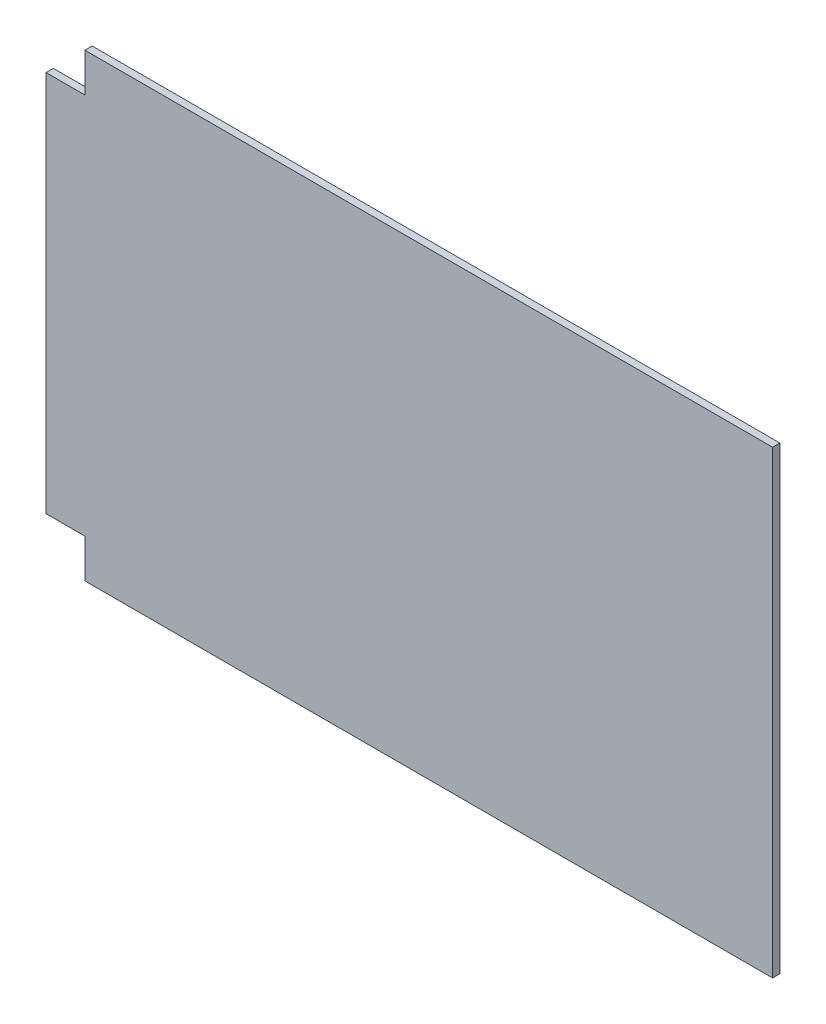
ISO-10303-21;
HEADER;
FILE_DESCRIPTION(('STEP AP214'),'2;1');
FILE_NAME('part.step','',(''),(''),'','','');
FILE_SCHEMA(('AUTOMOTIVE_DESIGN { 1 0 10303 214 1 1 1 1 }'));
ENDSEC;
DATA;
#1=APPLICATION_CONTEXT('core data for automotive mechanical design processes');
#2=APPLICATION_PROTOCOL_DEFINITION('international standard','automotive_design',2000,#1);
#3=PRODUCT_CONTEXT('',#1,'mechanical');
#4=PRODUCT('Part','Part','',(#3));
#5=PRODUCT_RELATED_PRODUCT_CATEGORY('part','',(#4));
#6=PRODUCT_DEFINITION_FORMATION('','',#4);
#7=PRODUCT_DEFINITION_CONTEXT('part definition',#1,'design');
#8=PRODUCT_DEFINITION('design','',#6,#7);
#9=PRODUCT_DEFINITION_SHAPE('','',#8);
#10=(LENGTH_UNIT() NAMED_UNIT(*) SI_UNIT(.MILLI.,.METRE.));
#11=(NAMED_UNIT(*) PLANE_ANGLE_UNIT() SI_UNIT($,.RADIAN.));
#12=(NAMED_UNIT(*) SI_UNIT($,.STERADIAN.) SOLID_ANGLE_UNIT());
#13=UNCERTAINTY_MEASURE_WITH_UNIT(LENGTH_MEASURE(1.E-05),#10,'distance_accuracy_value','');
#14=(GEOMETRIC_REPRESENTATION_CONTEXT(3) GLOBAL_UNCERTAINTY_ASSIGNED_CONTEXT((#13)) GLOBAL_UNIT_ASSIGNED_CONTEXT((#10,
#11,#12)) REPRESENTATION_CONTEXT('',''));
#15=CARTESIAN_POINT('',(0.,0.,0.));
#16=DIRECTION('',(0.,0.,1.));
#17=DIRECTION('',(1.,0.,0.));
#18=AXIS2_PLACEMENT_3D('',#15,#16,#17);
#19=CARTESIAN_POINT('',(-250.4,150.400000000001,4.75));
#20=DIRECTION('',(1.,0.,0.));
#21=DIRECTION('',(0.,1.,0.));
#22=AXIS2_PLACEMENT_3D('',#19,#20,#21);
#23=PLANE('',#22);
#24=DIRECTION('',(0.,-1.,0.));
#25=VECTOR('',#24,1.);
#26=CARTESIAN_POINT('',(-250.4,150.400000000001,4.75));
#27=LINE('',#26,#25);
#28=CARTESIAN_POINT('',(-250.4,125.000000000001,4.75));
#29=VERTEX_POINT('',#28);
#30=CARTESIAN_POINT('',(-250.4,-124.999999999999,4.75));
#31=VERTEX_POINT('',#30);
#32=EDGE_CURVE('E121',#29,#31,#27,.T.);
#33=ORIENTED_EDGE('',*,*,#32,.F.);
#34=DIRECTION('',(0.,0.,-1.));
#35=VECTOR('',#34,1.);
#36=CARTESIAN_POINT('',(-250.4,125.000000000001,10.));
#37=LINE('',#36,#35);
#38=CARTESIAN_POINT('',(-250.4,125.000000000001,0.));
#39=VERTEX_POINT('',#38);
#40=EDGE_CURVE('E110',#29,#39,#37,.T.);
#41=ORIENTED_EDGE('',*,*,#40,.T.);
#42=DIRECTION('',(0.,-1.,0.));
#43=VECTOR('',#42,1.);
#44=CARTESIAN_POINT('',(-250.4,150.400000000001,0.));
#45=LINE('',#44,#43);
#46=CARTESIAN_POINT('',(-250.4,-124.999999999999,0.));
#47=VERTEX_POINT('',#46);
#48=EDGE_CURVE('E125',#39,#47,#45,.T.);
#49=ORIENTED_EDGE('',*,*,#48,.T.);
#50=DIRECTION('',(0.,0.,-1.));
#51=VECTOR('',#50,1.);
#52=CARTESIAN_POINT('',(-250.4,-124.999999999999,10.));
#53=LINE('',#52,#51);
#54=EDGE_CURVE('E142',#31,#47,#53,.T.);
#55=ORIENTED_EDGE('',*,*,#54,.F.);
#56=EDGE_LOOP('',(#33,#41,#49,#55));
#57=FACE_BOUND('',#56,.T.);
#58=ADVANCED_FACE('F37',(#57),#23,.F.);
#59=CARTESIAN_POINT('',(-250.4,-150.399999999999,4.75));
#60=DIRECTION('',(0.,1.,0.));
#61=DIRECTION('',(0.,0.,1.));
#62=AXIS2_PLACEMENT_3D('',#59,#60,#61);
#63=PLANE('',#62);
#64=DIRECTION('',(1.,0.,0.));
#65=VECTOR('',#64,1.);
#66=CARTESIAN_POINT('',(-250.4,-150.399999999999,0.));
#67=LINE('',#66,#65);
#68=CARTESIAN_POINT('',(-225.,-150.399999999999,0.));
#69=VERTEX_POINT('',#68);
#70=CARTESIAN_POINT('',(225.,-150.399999999999,0.));
#71=VERTEX_POINT('',#70);
#72=EDGE_CURVE('E122',#69,#71,#67,.T.);
#73=ORIENTED_EDGE('',*,*,#72,.T.);
#74=DIRECTION('',(0.,0.,-1.));
#75=VECTOR('',#74,1.);
#76=CARTESIAN_POINT('',(225.,-150.399999999999,10.));
#77=LINE('',#76,#75);
#78=CARTESIAN_POINT('',(225.,-150.399999999999,4.75));
#79=VERTEX_POINT('',#78);
#80=EDGE_CURVE('E53',#79,#71,#77,.T.);
#81=ORIENTED_EDGE('',*,*,#80,.F.);
#82=DIRECTION('',(1.,0.,0.));
#83=VECTOR('',#82,1.);
#84=CARTESIAN_POINT('',(-250.4,-150.399999999999,4.75));
#85=LINE('',#84,#83);
#86=CARTESIAN_POINT('',(-225.,-150.399999999999,4.75));
#87=VERTEX_POINT('',#86);
#88=EDGE_CURVE('E45',#87,#79,#85,.T.);
#89=ORIENTED_EDGE('',*,*,#88,.F.);
#90=DIRECTION('',(0.,0.,-1.));
#91=VECTOR('',#90,1.);
#92=CARTESIAN_POINT('',(-225.,-150.399999999999,10.));
#93=LINE('',#92,#91);
#94=EDGE_CURVE('E147',#87,#69,#93,.T.);
#95=ORIENTED_EDGE('',*,*,#94,.T.);
#96=EDGE_LOOP('',(#73,#81,#89,#95));
#97=FACE_BOUND('',#96,.T.);
#98=ADVANCED_FACE('F177',(#97),#63,.F.);
#99=CARTESIAN_POINT('',(-250.4,150.400000000001,4.75));
#100=DIRECTION('',(0.,1.,0.));
#101=DIRECTION('',(0.,0.,1.));
#102=AXIS2_PLACEMENT_3D('',#99,#100,#101);
#103=PLANE('',#102);
#104=DIRECTION('',(0.,0.,-1.));
#105=VECTOR('',#104,1.);
#106=CARTESIAN_POINT('',(225.,150.400000000001,10.));
#107=LINE('',#106,#105);
#108=CARTESIAN_POINT('',(225.,150.400000000001,4.75));
#109=VERTEX_POINT('',#108);
#110=CARTESIAN_POINT('',(225.,150.400000000001,0.));
#111=VERTEX_POINT('',#110);
#112=EDGE_CURVE('E104',#109,#111,#107,.T.);
#113=ORIENTED_EDGE('',*,*,#112,.T.);
#114=DIRECTION('',(1.,0.,0.));
#115=VECTOR('',#114,1.);
#116=CARTESIAN_POINT('',(-250.4,150.400000000001,0.));
#117=LINE('',#116,#115);
#118=CARTESIAN_POINT('',(-225.,150.400000000001,0.));
#119=VERTEX_POINT('',#118);
#120=EDGE_CURVE('E40',#119,#111,#117,.T.);
#121=ORIENTED_EDGE('',*,*,#120,.F.);
#122=DIRECTION('',(0.,0.,-1.));
#123=VECTOR('',#122,1.);
#124=CARTESIAN_POINT('',(-225.,150.400000000001,10.));
#125=LINE('',#124,#123);
#126=CARTESIAN_POINT('',(-225.,150.400000000001,4.75));
#127=VERTEX_POINT('',#126);
#128=EDGE_CURVE('E61',#127,#119,#125,.T.);
#129=ORIENTED_EDGE('',*,*,#128,.F.);
#130=DIRECTION('',(1.,0.,0.));
#131=VECTOR('',#130,1.);
#132=CARTESIAN_POINT('',(-250.4,150.400000000001,4.75));
#133=LINE('',#132,#131);
#134=EDGE_CURVE('E11',#127,#109,#133,.T.);
#135=ORIENTED_EDGE('',*,*,#134,.T.);
#136=EDGE_LOOP('',(#113,#121,#129,#135));
#137=FACE_BOUND('',#136,.T.);
#138=ADVANCED_FACE('F114',(#137),#103,.T.);
#139=CARTESIAN_POINT('',(0.,0.,4.75));
#140=DIRECTION('',(0.,0.,1.));
#141=DIRECTION('',(1.,0.,0.));
#142=AXIS2_PLACEMENT_3D('',#139,#140,#141);
#143=PLANE('',#142);
#144=DIRECTION('',(0.,-1.,0.));
#145=VECTOR('',#144,1.);
#146=CARTESIAN_POINT('',(225.,0.,4.75));
#147=LINE('',#146,#145);
#148=EDGE_CURVE('E129',#109,#79,#147,.T.);
#149=ORIENTED_EDGE('',*,*,#148,.F.);
#150=ORIENTED_EDGE('',*,*,#134,.F.);
#151=DIRECTION('',(0.,1.,0.));
#152=VECTOR('',#151,1.);
#153=CARTESIAN_POINT('',(-225.,0.,4.75));
#154=LINE('',#153,#152);
#155=CARTESIAN_POINT('',(-225.,125.000000000001,4.75));
#156=VERTEX_POINT('',#155);
#157=EDGE_CURVE('E137',#156,#127,#154,.T.);
#158=ORIENTED_EDGE('',*,*,#157,.F.);
#159=DIRECTION('',(1.,0.,0.));
#160=VECTOR('',#159,1.);
#161=CARTESIAN_POINT('',(0.,125.000000000001,4.75));
#162=LINE('',#161,#160);
#163=EDGE_CURVE('E135',#29,#156,#162,.T.);
#164=ORIENTED_EDGE('',*,*,#163,.F.);
#165=ORIENTED_EDGE('',*,*,#32,.T.);
#166=DIRECTION('',(-1.,0.,0.));
#167=VECTOR('',#166,1.);
#168=CARTESIAN_POINT('',(0.,-124.999999999999,4.75));
#169=LINE('',#168,#167);
#170=CARTESIAN_POINT('',(-225.,-124.999999999999,4.75));
#171=VERTEX_POINT('',#170);
#172=EDGE_CURVE('E116',#171,#31,#169,.T.);
#173=ORIENTED_EDGE('',*,*,#172,.F.);
#174=DIRECTION('',(0.,1.,0.));
#175=VECTOR('',#174,1.);
#176=CARTESIAN_POINT('',(-225.000000000001,-1.47519791657871E-12,4.75));
#177=LINE('',#176,#175);
#178=EDGE_CURVE('E139',#87,#171,#177,.T.);
#179=ORIENTED_EDGE('',*,*,#178,.F.);
#180=ORIENTED_EDGE('',*,*,#88,.T.);
#181=EDGE_LOOP('',(#149,#150,#158,#164,#165,#173,#179,#180));
#182=FACE_BOUND('',#181,.T.);
#183=ADVANCED_FACE('F174',(#182),#143,.T.);
#184=CARTESIAN_POINT('',(0.,0.,0.));
#185=DIRECTION('',(0.,0.,1.));
#186=DIRECTION('',(1.,0.,0.));
#187=AXIS2_PLACEMENT_3D('',#184,#185,#186);
#188=PLANE('',#187);
#189=ORIENTED_EDGE('',*,*,#120,.T.);
#190=DIRECTION('',(0.,1.,0.));
#191=VECTOR('',#190,1.);
#192=CARTESIAN_POINT('',(225.,150.400000000001,0.));
#193=LINE('',#192,#191);
#194=EDGE_CURVE('E101',#71,#111,#193,.T.);
#195=ORIENTED_EDGE('',*,*,#194,.F.);
#196=ORIENTED_EDGE('',*,*,#72,.F.);
#197=DIRECTION('',(0.,-1.,0.));
#198=VECTOR('',#197,1.);
#199=CARTESIAN_POINT('',(-225.,-150.399999999999,0.));
#200=LINE('',#199,#198);
#201=CARTESIAN_POINT('',(-225.,-124.999999999999,0.));
#202=VERTEX_POINT('',#201);
#203=EDGE_CURVE('E145',#202,#69,#200,.T.);
#204=ORIENTED_EDGE('',*,*,#203,.F.);
#205=DIRECTION('',(1.,0.,0.));
#206=VECTOR('',#205,1.);
#207=CARTESIAN_POINT('',(-250.4,-124.999999999999,0.));
#208=LINE('',#207,#206);
#209=EDGE_CURVE('E150',#47,#202,#208,.T.);
#210=ORIENTED_EDGE('',*,*,#209,.F.);
#211=ORIENTED_EDGE('',*,*,#48,.F.);
#212=DIRECTION('',(-1.,0.,0.));
#213=VECTOR('',#212,1.);
#214=CARTESIAN_POINT('',(-250.4,125.000000000001,0.));
#215=LINE('',#214,#213);
#216=CARTESIAN_POINT('',(-225.,125.000000000001,0.));
#217=VERTEX_POINT('',#216);
#218=EDGE_CURVE('E155',#217,#39,#215,.T.);
#219=ORIENTED_EDGE('',*,*,#218,.F.);
#220=DIRECTION('',(0.,-1.,0.));
#221=VECTOR('',#220,1.);
#222=CARTESIAN_POINT('',(-225.,150.400000000001,0.));
#223=LINE('',#222,#221);
#224=EDGE_CURVE('E120',#119,#217,#223,.T.);
#225=ORIENTED_EDGE('',*,*,#224,.F.);
#226=EDGE_LOOP('',(#189,#195,#196,#204,#210,#211,#219,#225));
#227=FACE_BOUND('',#226,.T.);
#228=ADVANCED_FACE('F118',(#227),#188,.F.);
#229=CARTESIAN_POINT('',(-225.,-150.399999999999,10.));
#230=DIRECTION('',(1.,0.,0.));
#231=DIRECTION('',(0.,1.,0.));
#232=AXIS2_PLACEMENT_3D('',#229,#230,#231);
#233=PLANE('',#232);
#234=ORIENTED_EDGE('',*,*,#178,.T.);
#235=DIRECTION('',(0.,0.,-1.));
#236=VECTOR('',#235,1.);
#237=CARTESIAN_POINT('',(-225.,-124.999999999999,10.));
#238=LINE('',#237,#236);
#239=EDGE_CURVE('E144',#171,#202,#238,.T.);
#240=ORIENTED_EDGE('',*,*,#239,.T.);
#241=ORIENTED_EDGE('',*,*,#203,.T.);
#242=ORIENTED_EDGE('',*,*,#94,.F.);
#243=EDGE_LOOP('',(#234,#240,#241,#242));
#244=FACE_BOUND('',#243,.T.);
#245=ADVANCED_FACE('F180',(#244),#233,.F.);
#246=CARTESIAN_POINT('',(-250.4,-124.999999999999,10.));
#247=DIRECTION('',(0.,1.,0.));
#248=DIRECTION('',(0.,0.,1.));
#249=AXIS2_PLACEMENT_3D('',#246,#247,#248);
#250=PLANE('',#249);
#251=ORIENTED_EDGE('',*,*,#172,.T.);
#252=ORIENTED_EDGE('',*,*,#54,.T.);
#253=ORIENTED_EDGE('',*,*,#209,.T.);
#254=ORIENTED_EDGE('',*,*,#239,.F.);
#255=EDGE_LOOP('',(#251,#252,#253,#254));
#256=FACE_BOUND('',#255,.T.);
#257=ADVANCED_FACE('F183',(#256),#250,.F.);
#258=CARTESIAN_POINT('',(-250.4,125.000000000001,10.));
#259=DIRECTION('',(0.,-1.,0.));
#260=DIRECTION('',(0.,0.,-1.));
#261=AXIS2_PLACEMENT_3D('',#258,#259,#260);
#262=PLANE('',#261);
#263=ORIENTED_EDGE('',*,*,#163,.T.);
#264=DIRECTION('',(0.,0.,-1.));
#265=VECTOR('',#264,1.);
#266=CARTESIAN_POINT('',(-225.,125.000000000001,10.));
#267=LINE('',#266,#265);
#268=EDGE_CURVE('E154',#156,#217,#267,.T.);
#269=ORIENTED_EDGE('',*,*,#268,.T.);
#270=ORIENTED_EDGE('',*,*,#218,.T.);
#271=ORIENTED_EDGE('',*,*,#40,.F.);
#272=EDGE_LOOP('',(#263,#269,#270,#271));
#273=FACE_BOUND('',#272,.T.);
#274=ADVANCED_FACE('F167',(#273),#262,.F.);
#275=CARTESIAN_POINT('',(-225.,150.400000000001,10.));
#276=DIRECTION('',(1.,0.,0.));
#277=DIRECTION('',(0.,0.,-1.));
#278=AXIS2_PLACEMENT_3D('',#275,#276,#277);
#279=PLANE('',#278);
#280=ORIENTED_EDGE('',*,*,#157,.T.);
#281=ORIENTED_EDGE('',*,*,#128,.T.);
#282=ORIENTED_EDGE('',*,*,#224,.T.);
#283=ORIENTED_EDGE('',*,*,#268,.F.);
#284=EDGE_LOOP('',(#280,#281,#282,#283));
#285=FACE_BOUND('',#284,.T.);
#286=ADVANCED_FACE('F162',(#285),#279,.F.);
#287=CARTESIAN_POINT('',(225.,150.400000000001,10.));
#288=DIRECTION('',(-1.,0.,0.));
#289=DIRECTION('',(0.,0.,1.));
#290=AXIS2_PLACEMENT_3D('',#287,#288,#289);
#291=PLANE('',#290);
#292=ORIENTED_EDGE('',*,*,#148,.T.);
#293=ORIENTED_EDGE('',*,*,#80,.T.);
#294=ORIENTED_EDGE('',*,*,#194,.T.);
#295=ORIENTED_EDGE('',*,*,#112,.F.);
#296=EDGE_LOOP('',(#292,#293,#294,#295));
#297=FACE_BOUND('',#296,.T.);
#298=ADVANCED_FACE('F103',(#297),#291,.F.);
#299=CLOSED_SHELL('',(#58,#98,#138,#183,#228,#245,#257,#274,#286,#298));
#300=MANIFOLD_SOLID_BREP('B2',#299);
#301=ADVANCED_BREP_SHAPE_REPRESENTATION('',(#18,#300),#14);
#302=SHAPE_DEFINITION_REPRESENTATION(#9,#301);
ENDSEC;
END-ISO-10303-21;
